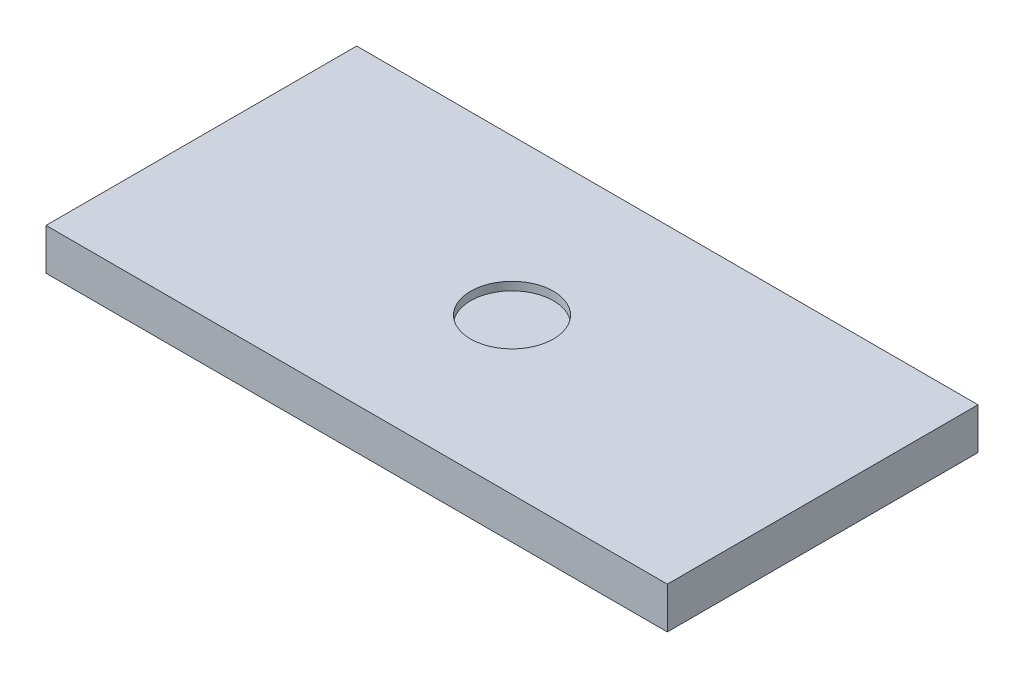
ISO-10303-21;
HEADER;
FILE_DESCRIPTION(('STEP AP214'),'2;1');
FILE_NAME('part.step','',(''),(''),'','','');
FILE_SCHEMA(('AUTOMOTIVE_DESIGN { 1 0 10303 214 1 1 1 1 }'));
ENDSEC;
DATA;
#1=APPLICATION_CONTEXT('core data for automotive mechanical design processes');
#2=APPLICATION_PROTOCOL_DEFINITION('international standard','automotive_design',2000,#1);
#3=PRODUCT_CONTEXT('',#1,'mechanical');
#4=PRODUCT('Part','Part','',(#3));
#5=PRODUCT_RELATED_PRODUCT_CATEGORY('part','',(#4));
#6=PRODUCT_DEFINITION_FORMATION('','',#4);
#7=PRODUCT_DEFINITION_CONTEXT('part definition',#1,'design');
#8=PRODUCT_DEFINITION('design','',#6,#7);
#9=PRODUCT_DEFINITION_SHAPE('','',#8);
#10=(LENGTH_UNIT() NAMED_UNIT(*) SI_UNIT(.MILLI.,.METRE.));
#11=(NAMED_UNIT(*) PLANE_ANGLE_UNIT() SI_UNIT($,.RADIAN.));
#12=(NAMED_UNIT(*) SI_UNIT($,.STERADIAN.) SOLID_ANGLE_UNIT());
#13=UNCERTAINTY_MEASURE_WITH_UNIT(LENGTH_MEASURE(1.E-05),#10,'distance_accuracy_value','');
#14=(GEOMETRIC_REPRESENTATION_CONTEXT(3) GLOBAL_UNCERTAINTY_ASSIGNED_CONTEXT((#13)) GLOBAL_UNIT_ASSIGNED_CONTEXT((#10,
#11,#12)) REPRESENTATION_CONTEXT('',''));
#15=CARTESIAN_POINT('',(0.,0.,0.));
#16=DIRECTION('',(0.,0.,1.));
#17=DIRECTION('',(1.,0.,0.));
#18=AXIS2_PLACEMENT_3D('',#15,#16,#17);
#19=CARTESIAN_POINT('',(75.,10.,37.5));
#20=DIRECTION('',(-1.,0.,0.));
#21=DIRECTION('',(0.,0.,1.));
#22=AXIS2_PLACEMENT_3D('',#19,#20,#21);
#23=PLANE('',#22);
#24=DIRECTION('',(0.,0.,-1.));
#25=VECTOR('',#24,1.);
#26=CARTESIAN_POINT('',(75.,0.,37.5));
#27=LINE('',#26,#25);
#28=CARTESIAN_POINT('',(75.,0.,37.5));
#29=VERTEX_POINT('',#28);
#30=CARTESIAN_POINT('',(75.,0.,-37.5));
#31=VERTEX_POINT('',#30);
#32=EDGE_CURVE('E96',#29,#31,#27,.T.);
#33=ORIENTED_EDGE('',*,*,#32,.T.);
#34=DIRECTION('',(0.,-1.,0.));
#35=VECTOR('',#34,1.);
#36=CARTESIAN_POINT('',(75.,10.,-37.5));
#37=LINE('',#36,#35);
#38=CARTESIAN_POINT('',(75.,10.,-37.5));
#39=VERTEX_POINT('',#38);
#40=EDGE_CURVE('E11',#39,#31,#37,.T.);
#41=ORIENTED_EDGE('',*,*,#40,.F.);
#42=DIRECTION('',(0.,0.,-1.));
#43=VECTOR('',#42,1.);
#44=CARTESIAN_POINT('',(75.,10.,37.5));
#45=LINE('',#44,#43);
#46=CARTESIAN_POINT('',(75.,10.,37.5));
#47=VERTEX_POINT('',#46);
#48=EDGE_CURVE('E84',#47,#39,#45,.T.);
#49=ORIENTED_EDGE('',*,*,#48,.F.);
#50=DIRECTION('',(0.,-1.,0.));
#51=VECTOR('',#50,1.);
#52=CARTESIAN_POINT('',(75.,10.,37.5));
#53=LINE('',#52,#51);
#54=EDGE_CURVE('E92',#47,#29,#53,.T.);
#55=ORIENTED_EDGE('',*,*,#54,.T.);
#56=EDGE_LOOP('',(#33,#41,#49,#55));
#57=FACE_BOUND('',#56,.T.);
#58=ADVANCED_FACE('F33',(#57),#23,.F.);
#59=CARTESIAN_POINT('',(-75.,10.,-37.5));
#60=DIRECTION('',(0.,0.,1.));
#61=DIRECTION('',(1.,0.,0.));
#62=AXIS2_PLACEMENT_3D('',#59,#60,#61);
#63=PLANE('',#62);
#64=DIRECTION('',(-1.,0.,0.));
#65=VECTOR('',#64,1.);
#66=CARTESIAN_POINT('',(-75.,0.,-37.5));
#67=LINE('',#66,#65);
#68=CARTESIAN_POINT('',(-75.,0.,-37.5));
#69=VERTEX_POINT('',#68);
#70=EDGE_CURVE('E88',#31,#69,#67,.T.);
#71=ORIENTED_EDGE('',*,*,#70,.T.);
#72=DIRECTION('',(0.,-1.,0.));
#73=VECTOR('',#72,1.);
#74=CARTESIAN_POINT('',(-75.,10.,-37.5));
#75=LINE('',#74,#73);
#76=CARTESIAN_POINT('',(-75.,10.,-37.5));
#77=VERTEX_POINT('',#76);
#78=EDGE_CURVE('E41',#77,#69,#75,.T.);
#79=ORIENTED_EDGE('',*,*,#78,.F.);
#80=DIRECTION('',(-1.,0.,0.));
#81=VECTOR('',#80,1.);
#82=CARTESIAN_POINT('',(-75.,10.,-37.5));
#83=LINE('',#82,#81);
#84=EDGE_CURVE('E79',#39,#77,#83,.T.);
#85=ORIENTED_EDGE('',*,*,#84,.F.);
#86=ORIENTED_EDGE('',*,*,#40,.T.);
#87=EDGE_LOOP('',(#71,#79,#85,#86));
#88=FACE_BOUND('',#87,.T.);
#89=ADVANCED_FACE('F87',(#88),#63,.F.);
#90=CARTESIAN_POINT('',(-75.,10.,37.5));
#91=DIRECTION('',(1.,0.,0.));
#92=DIRECTION('',(0.,0.,-1.));
#93=AXIS2_PLACEMENT_3D('',#90,#91,#92);
#94=PLANE('',#93);
#95=DIRECTION('',(0.,0.,1.));
#96=VECTOR('',#95,1.);
#97=CARTESIAN_POINT('',(-75.,0.,37.5));
#98=LINE('',#97,#96);
#99=CARTESIAN_POINT('',(-75.,0.,37.5));
#100=VERTEX_POINT('',#99);
#101=EDGE_CURVE('E66',#69,#100,#98,.T.);
#102=ORIENTED_EDGE('',*,*,#101,.T.);
#103=DIRECTION('',(0.,-1.,0.));
#104=VECTOR('',#103,1.);
#105=CARTESIAN_POINT('',(-75.,10.,37.5));
#106=LINE('',#105,#104);
#107=CARTESIAN_POINT('',(-75.,10.,37.5));
#108=VERTEX_POINT('',#107);
#109=EDGE_CURVE('E89',#108,#100,#106,.T.);
#110=ORIENTED_EDGE('',*,*,#109,.F.);
#111=DIRECTION('',(0.,0.,1.));
#112=VECTOR('',#111,1.);
#113=CARTESIAN_POINT('',(-75.,10.,37.5));
#114=LINE('',#113,#112);
#115=EDGE_CURVE('E82',#77,#108,#114,.T.);
#116=ORIENTED_EDGE('',*,*,#115,.F.);
#117=ORIENTED_EDGE('',*,*,#78,.T.);
#118=EDGE_LOOP('',(#102,#110,#116,#117));
#119=FACE_BOUND('',#118,.T.);
#120=ADVANCED_FACE('F90',(#119),#94,.F.);
#121=CARTESIAN_POINT('',(-75.,10.,37.5));
#122=DIRECTION('',(0.,0.,-1.));
#123=DIRECTION('',(-1.,0.,0.));
#124=AXIS2_PLACEMENT_3D('',#121,#122,#123);
#125=PLANE('',#124);
#126=DIRECTION('',(1.,0.,0.));
#127=VECTOR('',#126,1.);
#128=CARTESIAN_POINT('',(-75.,0.,37.5));
#129=LINE('',#128,#127);
#130=EDGE_CURVE('E72',#100,#29,#129,.T.);
#131=ORIENTED_EDGE('',*,*,#130,.T.);
#132=ORIENTED_EDGE('',*,*,#54,.F.);
#133=DIRECTION('',(1.,0.,0.));
#134=VECTOR('',#133,1.);
#135=CARTESIAN_POINT('',(-75.,10.,37.5));
#136=LINE('',#135,#134);
#137=EDGE_CURVE('E49',#108,#47,#136,.T.);
#138=ORIENTED_EDGE('',*,*,#137,.F.);
#139=ORIENTED_EDGE('',*,*,#109,.T.);
#140=EDGE_LOOP('',(#131,#132,#138,#139));
#141=FACE_BOUND('',#140,.T.);
#142=ADVANCED_FACE('F104',(#141),#125,.F.);
#143=CARTESIAN_POINT('',(0.,10.,0.));
#144=DIRECTION('',(0.,-1.,0.));
#145=DIRECTION('',(0.,0.,-1.));
#146=AXIS2_PLACEMENT_3D('',#143,#144,#145);
#147=PLANE('',#146);
#148=CARTESIAN_POINT('',(0.,10.,0.));
#149=DIRECTION('',(0.,1.,0.));
#150=DIRECTION('',(0.,0.,1.));
#151=AXIS2_PLACEMENT_3D('',#148,#149,#150);
#152=CIRCLE('',#151,10.);
#153=CARTESIAN_POINT('',(0.,10.,10.));
#154=VERTEX_POINT('',#153);
#155=EDGE_CURVE('E110',#154,#154,#152,.T.);
#156=ORIENTED_EDGE('',*,*,#155,.F.);
#157=EDGE_LOOP('',(#156));
#158=FACE_BOUND('',#157,.T.);
#159=ORIENTED_EDGE('',*,*,#48,.T.);
#160=ORIENTED_EDGE('',*,*,#84,.T.);
#161=ORIENTED_EDGE('',*,*,#115,.T.);
#162=ORIENTED_EDGE('',*,*,#137,.T.);
#163=EDGE_LOOP('',(#159,#160,#161,#162));
#164=FACE_BOUND('',#163,.T.);
#165=ADVANCED_FACE('F80',(#158,#164),#147,.F.);
#166=CARTESIAN_POINT('',(0.,0.,0.));
#167=DIRECTION('',(0.,-1.,0.));
#168=DIRECTION('',(0.,0.,-1.));
#169=AXIS2_PLACEMENT_3D('',#166,#167,#168);
#170=PLANE('',#169);
#171=ORIENTED_EDGE('',*,*,#32,.F.);
#172=ORIENTED_EDGE('',*,*,#130,.F.);
#173=ORIENTED_EDGE('',*,*,#101,.F.);
#174=ORIENTED_EDGE('',*,*,#70,.F.);
#175=EDGE_LOOP('',(#171,#172,#173,#174));
#176=FACE_BOUND('',#175,.T.);
#177=ADVANCED_FACE('F107',(#176),#170,.T.);
#178=CARTESIAN_POINT('',(0.,8.,0.));
#179=DIRECTION('',(0.,1.,0.));
#180=DIRECTION('',(0.,0.,1.));
#181=AXIS2_PLACEMENT_3D('',#178,#179,#180);
#182=CYLINDRICAL_SURFACE('',#181,10.);
#183=CARTESIAN_POINT('',(0.,8.,0.));
#184=DIRECTION('',(0.,1.,0.));
#185=DIRECTION('',(0.,0.,1.));
#186=AXIS2_PLACEMENT_3D('',#183,#184,#185);
#187=CIRCLE('',#186,10.);
#188=CARTESIAN_POINT('',(0.,8.,10.));
#189=VERTEX_POINT('',#188);
#190=EDGE_CURVE('E99',#189,#189,#187,.T.);
#191=ORIENTED_EDGE('',*,*,#190,.F.);
#192=EDGE_LOOP('',(#191));
#193=FACE_BOUND('',#192,.T.);
#194=ORIENTED_EDGE('',*,*,#155,.T.);
#195=EDGE_LOOP('',(#194));
#196=FACE_BOUND('',#195,.T.);
#197=ADVANCED_FACE('F118',(#193,#196),#182,.F.);
#198=CARTESIAN_POINT('',(0.,8.,0.));
#199=DIRECTION('',(0.,1.,0.));
#200=DIRECTION('',(0.,0.,1.));
#201=AXIS2_PLACEMENT_3D('',#198,#199,#200);
#202=PLANE('',#201);
#203=ORIENTED_EDGE('',*,*,#190,.T.);
#204=EDGE_LOOP('',(#203));
#205=FACE_BOUND('',#204,.T.);
#206=ADVANCED_FACE('F116',(#205),#202,.T.);
#207=CLOSED_SHELL('',(#58,#89,#120,#142,#165,#177,#197,#206));
#208=MANIFOLD_SOLID_BREP('B2',#207);
#209=ADVANCED_BREP_SHAPE_REPRESENTATION('',(#18,#208),#14);
#210=SHAPE_DEFINITION_REPRESENTATION(#9,#209);
ENDSEC;
END-ISO-10303-21;
